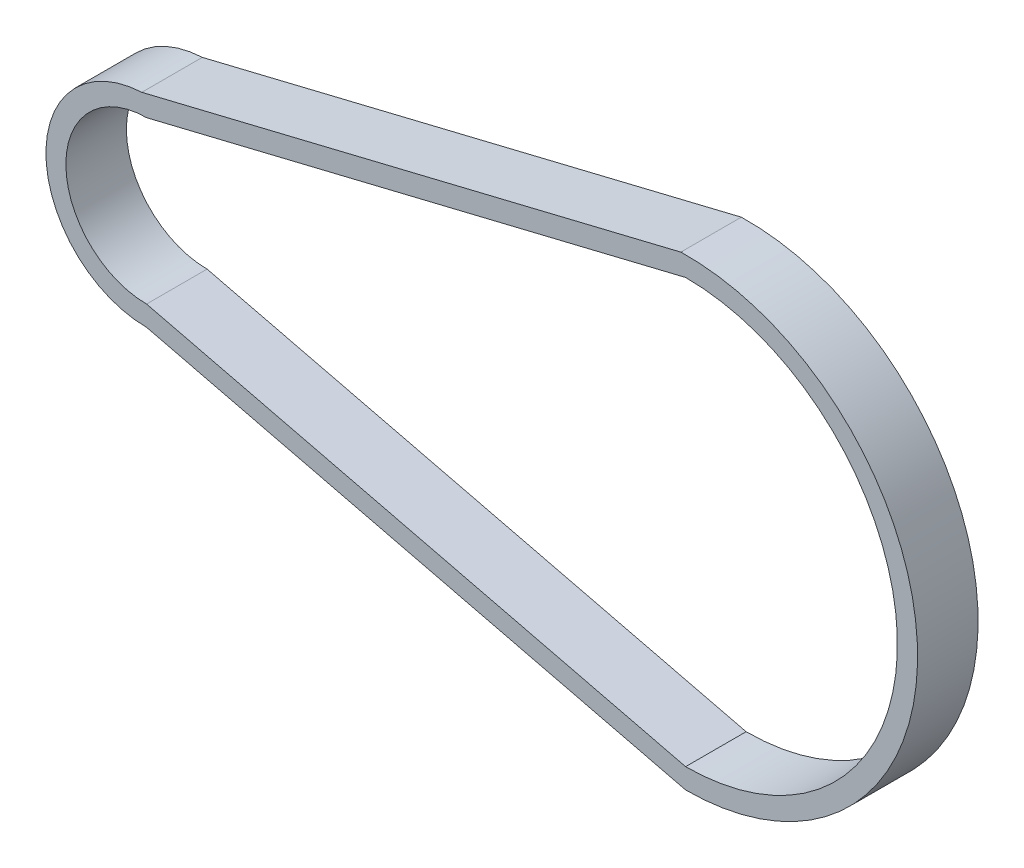
ISO-10303-21;
HEADER;
FILE_DESCRIPTION(('STEP AP214'),'2;1');
FILE_NAME('part.step','',(''),(''),'','','');
FILE_SCHEMA(('AUTOMOTIVE_DESIGN { 1 0 10303 214 1 1 1 1 }'));
ENDSEC;
DATA;
#1=APPLICATION_CONTEXT('core data for automotive mechanical design processes');
#2=APPLICATION_PROTOCOL_DEFINITION('international standard','automotive_design',2000,#1);
#3=PRODUCT_CONTEXT('',#1,'mechanical');
#4=PRODUCT('Part','Part','',(#3));
#5=PRODUCT_RELATED_PRODUCT_CATEGORY('part','',(#4));
#6=PRODUCT_DEFINITION_FORMATION('','',#4);
#7=PRODUCT_DEFINITION_CONTEXT('part definition',#1,'design');
#8=PRODUCT_DEFINITION('design','',#6,#7);
#9=PRODUCT_DEFINITION_SHAPE('','',#8);
#10=(LENGTH_UNIT() NAMED_UNIT(*) SI_UNIT(.MILLI.,.METRE.));
#11=(NAMED_UNIT(*) PLANE_ANGLE_UNIT() SI_UNIT($,.RADIAN.));
#12=(NAMED_UNIT(*) SI_UNIT($,.STERADIAN.) SOLID_ANGLE_UNIT());
#13=UNCERTAINTY_MEASURE_WITH_UNIT(LENGTH_MEASURE(1.E-05),#10,'distance_accuracy_value','');
#14=(GEOMETRIC_REPRESENTATION_CONTEXT(3) GLOBAL_UNCERTAINTY_ASSIGNED_CONTEXT((#13)) GLOBAL_UNIT_ASSIGNED_CONTEXT((#10,
#11,#12)) REPRESENTATION_CONTEXT('',''));
#15=CARTESIAN_POINT('',(0.,0.,0.));
#16=DIRECTION('',(0.,0.,1.));
#17=DIRECTION('',(1.,0.,0.));
#18=AXIS2_PLACEMENT_3D('',#15,#16,#17);
#19=CARTESIAN_POINT('',(-4.82299009049555,19.8267768595041,6.));
#20=DIRECTION('',(0.236363636363636,-0.971664670246355,0.));
#21=DIRECTION('',(0.971664670246355,0.236363636363636,0.));
#22=AXIS2_PLACEMENT_3D('',#19,#20,#21);
#23=PLANE('',#22);
#24=DIRECTION('',(-0.971664670246355,-0.236363636363636,0.));
#25=VECTOR('',#24,1.);
#26=CARTESIAN_POINT('',(-4.82299009049555,19.8267768595041,0.));
#27=LINE('',#26,#25);
#28=CARTESIAN_POINT('',(0.,21.,0.));
#29=VERTEX_POINT('',#28);
#30=CARTESIAN_POINT('',(-53.4415568635496,8.,0.));
#31=VERTEX_POINT('',#30);
#32=EDGE_CURVE('E157',#29,#31,#27,.T.);
#33=ORIENTED_EDGE('',*,*,#32,.F.);
#34=DIRECTION('',(0.,0.,-1.));
#35=VECTOR('',#34,1.);
#36=CARTESIAN_POINT('',(0.,21.,6.));
#37=LINE('',#36,#35);
#38=CARTESIAN_POINT('',(0.,21.,6.));
#39=VERTEX_POINT('',#38);
#40=EDGE_CURVE('E11',#39,#29,#37,.T.);
#41=ORIENTED_EDGE('',*,*,#40,.F.);
#42=DIRECTION('',(-0.971664670246355,-0.236363636363636,0.));
#43=VECTOR('',#42,1.);
#44=CARTESIAN_POINT('',(-4.82299009049555,19.8267768595041,6.));
#45=LINE('',#44,#43);
#46=CARTESIAN_POINT('',(-53.4415568635496,8.,6.));
#47=VERTEX_POINT('',#46);
#48=EDGE_CURVE('E127',#39,#47,#45,.T.);
#49=ORIENTED_EDGE('',*,*,#48,.T.);
#50=DIRECTION('',(0.,0.,-1.));
#51=VECTOR('',#50,1.);
#52=CARTESIAN_POINT('',(-53.4415568635496,8.,6.));
#53=LINE('',#52,#51);
#54=EDGE_CURVE('E60',#47,#31,#53,.T.);
#55=ORIENTED_EDGE('',*,*,#54,.T.);
#56=EDGE_LOOP('',(#33,#41,#49,#55));
#57=FACE_BOUND('',#56,.T.);
#58=ADVANCED_FACE('F41',(#57),#23,.T.);
#59=CARTESIAN_POINT('',(0.,0.,6.));
#60=DIRECTION('',(0.,0.,-1.));
#61=DIRECTION('',(-1.,0.,0.));
#62=AXIS2_PLACEMENT_3D('',#59,#60,#61);
#63=CYLINDRICAL_SURFACE('',#62,21.);
#64=CARTESIAN_POINT('',(0.,0.,0.));
#65=DIRECTION('',(0.,0.,1.));
#66=DIRECTION('',(1.,0.,0.));
#67=AXIS2_PLACEMENT_3D('',#64,#65,#66);
#68=CIRCLE('',#67,21.);
#69=CARTESIAN_POINT('',(0.,-21.,0.));
#70=VERTEX_POINT('',#69);
#71=EDGE_CURVE('E132',#29,#70,#68,.F.);
#72=ORIENTED_EDGE('',*,*,#71,.T.);
#73=DIRECTION('',(0.,0.,-1.));
#74=VECTOR('',#73,1.);
#75=CARTESIAN_POINT('',(0.,-21.,6.));
#76=LINE('',#75,#74);
#77=CARTESIAN_POINT('',(0.,-21.,6.));
#78=VERTEX_POINT('',#77);
#79=EDGE_CURVE('E51',#78,#70,#76,.T.);
#80=ORIENTED_EDGE('',*,*,#79,.F.);
#81=CARTESIAN_POINT('',(0.,0.,6.));
#82=DIRECTION('',(0.,0.,1.));
#83=DIRECTION('',(1.,0.,0.));
#84=AXIS2_PLACEMENT_3D('',#81,#82,#83);
#85=CIRCLE('',#84,21.);
#86=EDGE_CURVE('E122',#39,#78,#85,.F.);
#87=ORIENTED_EDGE('',*,*,#86,.F.);
#88=ORIENTED_EDGE('',*,*,#40,.T.);
#89=EDGE_LOOP('',(#72,#80,#87,#88));
#90=FACE_BOUND('',#89,.T.);
#91=ADVANCED_FACE('F130',(#90),#63,.F.);
#92=CARTESIAN_POINT('',(-4.82299009049555,-19.8267768595041,6.));
#93=DIRECTION('',(-0.236363636363636,-0.971664670246355,0.));
#94=DIRECTION('',(0.971664670246355,-0.236363636363636,0.));
#95=AXIS2_PLACEMENT_3D('',#92,#93,#94);
#96=PLANE('',#95);
#97=DIRECTION('',(-0.971664670246355,0.236363636363636,0.));
#98=VECTOR('',#97,1.);
#99=CARTESIAN_POINT('',(-4.82299009049555,-19.8267768595041,0.));
#100=LINE('',#99,#98);
#101=CARTESIAN_POINT('',(-53.4415568635496,-8.,0.));
#102=VERTEX_POINT('',#101);
#103=EDGE_CURVE('E154',#70,#102,#100,.T.);
#104=ORIENTED_EDGE('',*,*,#103,.T.);
#105=DIRECTION('',(0.,0.,-1.));
#106=VECTOR('',#105,1.);
#107=CARTESIAN_POINT('',(-53.4415568635496,-8.,6.));
#108=LINE('',#107,#106);
#109=CARTESIAN_POINT('',(-53.4415568635496,-8.,6.));
#110=VERTEX_POINT('',#109);
#111=EDGE_CURVE('E86',#110,#102,#108,.T.);
#112=ORIENTED_EDGE('',*,*,#111,.F.);
#113=DIRECTION('',(-0.971664670246355,0.236363636363636,0.));
#114=VECTOR('',#113,1.);
#115=CARTESIAN_POINT('',(-4.82299009049555,-19.8267768595041,6.));
#116=LINE('',#115,#114);
#117=EDGE_CURVE('E114',#78,#110,#116,.T.);
#118=ORIENTED_EDGE('',*,*,#117,.F.);
#119=ORIENTED_EDGE('',*,*,#79,.T.);
#120=EDGE_LOOP('',(#104,#112,#118,#119));
#121=FACE_BOUND('',#120,.T.);
#122=ADVANCED_FACE('F116',(#121),#96,.F.);
#123=CARTESIAN_POINT('',(-5.28232248006655,-21.7150413223141,6.));
#124=DIRECTION('',(0.236363636363636,0.971664670246355,0.));
#125=DIRECTION('',(-0.971664670246355,0.236363636363636,0.));
#126=AXIS2_PLACEMENT_3D('',#123,#124,#125);
#127=PLANE('',#126);
#128=DIRECTION('',(0.971664670246355,-0.236363636363636,0.));
#129=VECTOR('',#128,1.);
#130=CARTESIAN_POINT('',(-5.28232248006655,-21.7150413223141,0.));
#131=LINE('',#130,#129);
#132=CARTESIAN_POINT('',(-53.4415568635496,-10.,0.));
#133=VERTEX_POINT('',#132);
#134=CARTESIAN_POINT('',(0.,-23.,0.));
#135=VERTEX_POINT('',#134);
#136=EDGE_CURVE('E166',#133,#135,#131,.T.);
#137=ORIENTED_EDGE('',*,*,#136,.T.);
#138=DIRECTION('',(0.,0.,-1.));
#139=VECTOR('',#138,1.);
#140=CARTESIAN_POINT('',(0.,-23.,6.));
#141=LINE('',#140,#139);
#142=CARTESIAN_POINT('',(0.,-23.,6.));
#143=VERTEX_POINT('',#142);
#144=EDGE_CURVE('E45',#143,#135,#141,.T.);
#145=ORIENTED_EDGE('',*,*,#144,.F.);
#146=DIRECTION('',(0.971664670246355,-0.236363636363636,0.));
#147=VECTOR('',#146,1.);
#148=CARTESIAN_POINT('',(-5.28232248006655,-21.7150413223141,6.));
#149=LINE('',#148,#147);
#150=CARTESIAN_POINT('',(-53.4415568635496,-10.,6.));
#151=VERTEX_POINT('',#150);
#152=EDGE_CURVE('E99',#151,#143,#149,.T.);
#153=ORIENTED_EDGE('',*,*,#152,.F.);
#154=DIRECTION('',(0.,0.,-1.));
#155=VECTOR('',#154,1.);
#156=CARTESIAN_POINT('',(-53.4415568635496,-10.,6.));
#157=LINE('',#156,#155);
#158=EDGE_CURVE('E137',#151,#133,#157,.T.);
#159=ORIENTED_EDGE('',*,*,#158,.T.);
#160=EDGE_LOOP('',(#137,#145,#153,#159));
#161=FACE_BOUND('',#160,.T.);
#162=ADVANCED_FACE('F43',(#161),#127,.F.);
#163=CARTESIAN_POINT('',(0.0256394863434829,-0.025639486343485,6.));
#164=DIRECTION('',(0.,0.,-1.));
#165=DIRECTION('',(-1.,0.,0.));
#166=AXIS2_PLACEMENT_3D('',#163,#164,#165);
#167=CYLINDRICAL_SURFACE('',#166,22.9743748205412);
#168=CARTESIAN_POINT('',(0.0256394863434829,-0.025639486343485,0.));
#169=DIRECTION('',(0.,0.,1.));
#170=DIRECTION('',(1.,0.,0.));
#171=AXIS2_PLACEMENT_3D('',#168,#169,#170);
#172=CIRCLE('',#171,22.9743748205412);
#173=CARTESIAN_POINT('',(-0.472727272727272,22.9433293404927,0.));
#174=VERTEX_POINT('',#173);
#175=EDGE_CURVE('E163',#174,#135,#172,.F.);
#176=ORIENTED_EDGE('',*,*,#175,.F.);
#177=DIRECTION('',(0.,0.,-1.));
#178=VECTOR('',#177,1.);
#179=CARTESIAN_POINT('',(-0.472727272727272,22.9433293404927,6.));
#180=LINE('',#179,#178);
#181=CARTESIAN_POINT('',(-0.472727272727272,22.9433293404927,6.));
#182=VERTEX_POINT('',#181);
#183=EDGE_CURVE('E142',#182,#174,#180,.T.);
#184=ORIENTED_EDGE('',*,*,#183,.F.);
#185=CARTESIAN_POINT('',(0.0256394863434829,-0.025639486343485,6.));
#186=DIRECTION('',(0.,0.,1.));
#187=DIRECTION('',(1.,0.,0.));
#188=AXIS2_PLACEMENT_3D('',#185,#186,#187);
#189=CIRCLE('',#188,22.9743748205412);
#190=EDGE_CURVE('E174',#182,#143,#189,.F.);
#191=ORIENTED_EDGE('',*,*,#190,.T.);
#192=ORIENTED_EDGE('',*,*,#144,.T.);
#193=EDGE_LOOP('',(#176,#184,#191,#192));
#194=FACE_BOUND('',#193,.T.);
#195=ADVANCED_FACE('F176',(#194),#167,.T.);
#196=CARTESIAN_POINT('',(-5.29571736322282,21.7701061999968,6.));
#197=DIRECTION('',(0.236363636363636,-0.971664670246355,0.));
#198=DIRECTION('',(0.971664670246355,0.236363636363636,0.));
#199=AXIS2_PLACEMENT_3D('',#196,#197,#198);
#200=PLANE('',#199);
#201=DIRECTION('',(-0.971664670246355,-0.236363636363636,0.));
#202=VECTOR('',#201,1.);
#203=CARTESIAN_POINT('',(-5.29571736322282,21.7701061999968,0.));
#204=LINE('',#203,#202);
#205=CARTESIAN_POINT('',(-53.9142841362768,9.94332934049272,0.));
#206=VERTEX_POINT('',#205);
#207=EDGE_CURVE('E161',#174,#206,#204,.T.);
#208=ORIENTED_EDGE('',*,*,#207,.T.);
#209=DIRECTION('',(0.,0.,-1.));
#210=VECTOR('',#209,1.);
#211=CARTESIAN_POINT('',(-53.9142841362768,9.94332934049272,6.));
#212=LINE('',#211,#210);
#213=CARTESIAN_POINT('',(-53.9142841362768,9.94332934049272,6.));
#214=VERTEX_POINT('',#213);
#215=EDGE_CURVE('E140',#214,#206,#212,.T.);
#216=ORIENTED_EDGE('',*,*,#215,.F.);
#217=DIRECTION('',(-0.971664670246355,-0.236363636363636,0.));
#218=VECTOR('',#217,1.);
#219=CARTESIAN_POINT('',(-5.29571736322282,21.7701061999968,6.));
#220=LINE('',#219,#218);
#221=EDGE_CURVE('E172',#182,#214,#220,.T.);
#222=ORIENTED_EDGE('',*,*,#221,.F.);
#223=ORIENTED_EDGE('',*,*,#183,.T.);
#224=EDGE_LOOP('',(#208,#216,#222,#223));
#225=FACE_BOUND('',#224,.T.);
#226=ADVANCED_FACE('F180',(#225),#200,.F.);
#227=CARTESIAN_POINT('',(-53.4415568635496,-0.0227326775945002,6.));
#228=DIRECTION('',(0.,0.,-1.));
#229=DIRECTION('',(-1.,0.,0.));
#230=AXIS2_PLACEMENT_3D('',#227,#228,#229);
#231=CYLINDRICAL_SURFACE('',#230,9.9772673224055);
#232=CARTESIAN_POINT('',(-53.4415568635496,-0.0227326775945002,0.));
#233=DIRECTION('',(0.,0.,1.));
#234=DIRECTION('',(1.,0.,0.));
#235=AXIS2_PLACEMENT_3D('',#232,#233,#234);
#236=CIRCLE('',#235,9.9772673224055);
#237=EDGE_CURVE('E159',#206,#133,#236,.T.);
#238=ORIENTED_EDGE('',*,*,#237,.T.);
#239=ORIENTED_EDGE('',*,*,#158,.F.);
#240=CARTESIAN_POINT('',(-53.4415568635496,-0.0227326775945002,6.));
#241=DIRECTION('',(0.,0.,1.));
#242=DIRECTION('',(1.,0.,0.));
#243=AXIS2_PLACEMENT_3D('',#240,#241,#242);
#244=CIRCLE('',#243,9.9772673224055);
#245=EDGE_CURVE('E170',#214,#151,#244,.T.);
#246=ORIENTED_EDGE('',*,*,#245,.F.);
#247=ORIENTED_EDGE('',*,*,#215,.T.);
#248=EDGE_LOOP('',(#238,#239,#246,#247));
#249=FACE_BOUND('',#248,.T.);
#250=ADVANCED_FACE('F183',(#249),#231,.T.);
#251=CARTESIAN_POINT('',(-53.4415568635496,0.,6.));
#252=DIRECTION('',(0.,0.,-1.));
#253=DIRECTION('',(-1.,0.,0.));
#254=AXIS2_PLACEMENT_3D('',#251,#252,#253);
#255=CYLINDRICAL_SURFACE('',#254,8.);
#256=CARTESIAN_POINT('',(-53.4415568635496,0.,0.));
#257=DIRECTION('',(0.,0.,1.));
#258=DIRECTION('',(1.,0.,0.));
#259=AXIS2_PLACEMENT_3D('',#256,#257,#258);
#260=CIRCLE('',#259,8.);
#261=EDGE_CURVE('E151',#31,#102,#260,.T.);
#262=ORIENTED_EDGE('',*,*,#261,.F.);
#263=ORIENTED_EDGE('',*,*,#54,.F.);
#264=CARTESIAN_POINT('',(-53.4415568635496,0.,6.));
#265=DIRECTION('',(0.,0.,1.));
#266=DIRECTION('',(1.,0.,0.));
#267=AXIS2_PLACEMENT_3D('',#264,#265,#266);
#268=CIRCLE('',#267,8.);
#269=EDGE_CURVE('E121',#47,#110,#268,.T.);
#270=ORIENTED_EDGE('',*,*,#269,.T.);
#271=ORIENTED_EDGE('',*,*,#111,.T.);
#272=EDGE_LOOP('',(#262,#263,#270,#271));
#273=FACE_BOUND('',#272,.T.);
#274=ADVANCED_FACE('F191',(#273),#255,.F.);
#275=CARTESIAN_POINT('',(0.,0.,6.));
#276=DIRECTION('',(0.,0.,1.));
#277=DIRECTION('',(1.,0.,0.));
#278=AXIS2_PLACEMENT_3D('',#275,#276,#277);
#279=PLANE('',#278);
#280=ORIENTED_EDGE('',*,*,#152,.T.);
#281=ORIENTED_EDGE('',*,*,#190,.F.);
#282=ORIENTED_EDGE('',*,*,#221,.T.);
#283=ORIENTED_EDGE('',*,*,#245,.T.);
#284=EDGE_LOOP('',(#280,#281,#282,#283));
#285=FACE_BOUND('',#284,.T.);
#286=ORIENTED_EDGE('',*,*,#48,.F.);
#287=ORIENTED_EDGE('',*,*,#86,.T.);
#288=ORIENTED_EDGE('',*,*,#117,.T.);
#289=ORIENTED_EDGE('',*,*,#269,.F.);
#290=EDGE_LOOP('',(#286,#287,#288,#289));
#291=FACE_BOUND('',#290,.T.);
#292=ADVANCED_FACE('F126',(#285,#291),#279,.T.);
#293=CARTESIAN_POINT('',(0.,0.,0.));
#294=DIRECTION('',(0.,0.,1.));
#295=DIRECTION('',(1.,0.,0.));
#296=AXIS2_PLACEMENT_3D('',#293,#294,#295);
#297=PLANE('',#296);
#298=ORIENTED_EDGE('',*,*,#136,.F.);
#299=ORIENTED_EDGE('',*,*,#237,.F.);
#300=ORIENTED_EDGE('',*,*,#207,.F.);
#301=ORIENTED_EDGE('',*,*,#175,.T.);
#302=EDGE_LOOP('',(#298,#299,#300,#301));
#303=FACE_BOUND('',#302,.T.);
#304=ORIENTED_EDGE('',*,*,#32,.T.);
#305=ORIENTED_EDGE('',*,*,#261,.T.);
#306=ORIENTED_EDGE('',*,*,#103,.F.);
#307=ORIENTED_EDGE('',*,*,#71,.F.);
#308=EDGE_LOOP('',(#304,#305,#306,#307));
#309=FACE_BOUND('',#308,.T.);
#310=ADVANCED_FACE('F187',(#303,#309),#297,.F.);
#311=CLOSED_SHELL('',(#58,#91,#122,#162,#195,#226,#250,#274,#292,#310));
#312=MANIFOLD_SOLID_BREP('B2',#311);
#313=ADVANCED_BREP_SHAPE_REPRESENTATION('',(#18,#312),#14);
#314=SHAPE_DEFINITION_REPRESENTATION(#9,#313);
ENDSEC;
END-ISO-10303-21;
